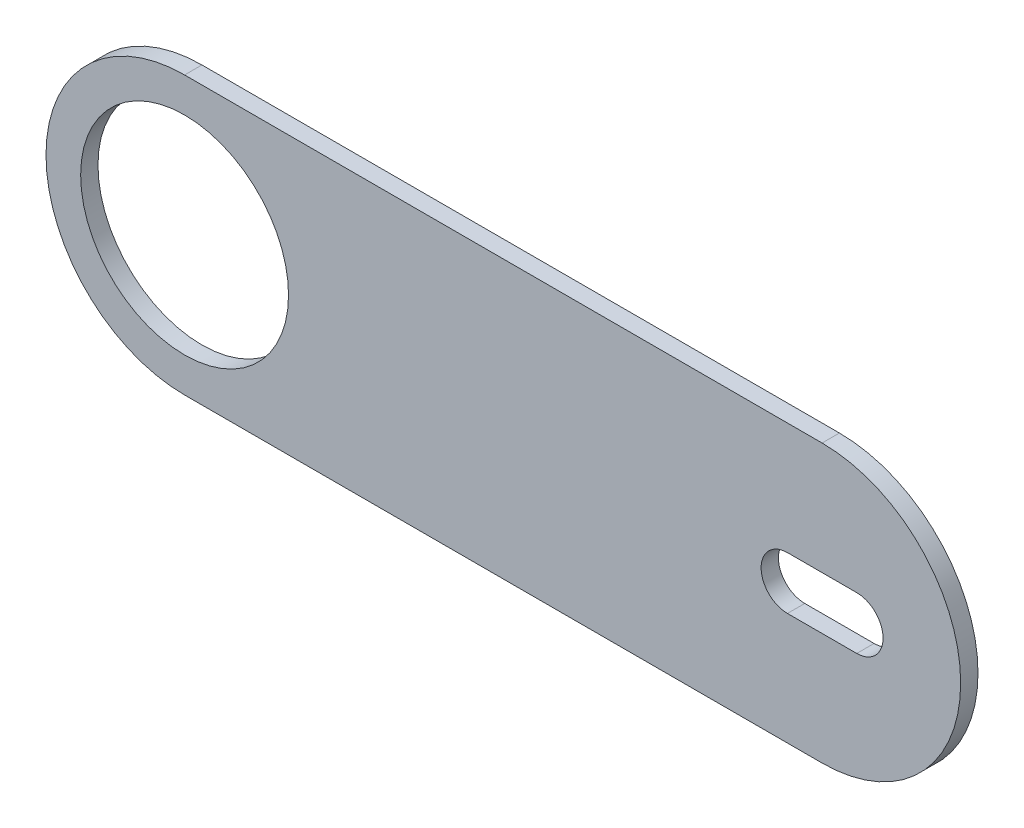
ISO-10303-21;
HEADER;
FILE_DESCRIPTION(('STEP AP214'),'2;1');
FILE_NAME('part.step','',(''),(''),'','','');
FILE_SCHEMA(('AUTOMOTIVE_DESIGN { 1 0 10303 214 1 1 1 1 }'));
ENDSEC;
DATA;
#1=APPLICATION_CONTEXT('core data for automotive mechanical design processes');
#2=APPLICATION_PROTOCOL_DEFINITION('international standard','automotive_design',2000,#1);
#3=PRODUCT_CONTEXT('',#1,'mechanical');
#4=PRODUCT('Part','Part','',(#3));
#5=PRODUCT_RELATED_PRODUCT_CATEGORY('part','',(#4));
#6=PRODUCT_DEFINITION_FORMATION('','',#4);
#7=PRODUCT_DEFINITION_CONTEXT('part definition',#1,'design');
#8=PRODUCT_DEFINITION('design','',#6,#7);
#9=PRODUCT_DEFINITION_SHAPE('','',#8);
#10=(LENGTH_UNIT() NAMED_UNIT(*) SI_UNIT(.MILLI.,.METRE.));
#11=(NAMED_UNIT(*) PLANE_ANGLE_UNIT() SI_UNIT($,.RADIAN.));
#12=(NAMED_UNIT(*) SI_UNIT($,.STERADIAN.) SOLID_ANGLE_UNIT());
#13=UNCERTAINTY_MEASURE_WITH_UNIT(LENGTH_MEASURE(1.E-05),#10,'distance_accuracy_value','');
#14=(GEOMETRIC_REPRESENTATION_CONTEXT(3) GLOBAL_UNCERTAINTY_ASSIGNED_CONTEXT((#13)) GLOBAL_UNIT_ASSIGNED_CONTEXT((#10,
#11,#12)) REPRESENTATION_CONTEXT('',''));
#15=CARTESIAN_POINT('',(0.,0.,0.));
#16=DIRECTION('',(0.,0.,1.));
#17=DIRECTION('',(1.,0.,0.));
#18=AXIS2_PLACEMENT_3D('',#15,#16,#17);
#19=CARTESIAN_POINT('',(-29.21,0.,1.5875));
#20=DIRECTION('',(0.,0.,1.));
#21=DIRECTION('',(1.,0.,0.));
#22=AXIS2_PLACEMENT_3D('',#19,#20,#21);
#23=PLANE('',#22);
#24=DIRECTION('',(-1.,0.,0.));
#25=VECTOR('',#24,1.);
#26=CARTESIAN_POINT('',(32.385,2.413,1.5875));
#27=LINE('',#26,#25);
#28=CARTESIAN_POINT('',(32.385,2.413,1.5875));
#29=VERTEX_POINT('',#28);
#30=CARTESIAN_POINT('',(26.035,2.413,1.5875));
#31=VERTEX_POINT('',#30);
#32=EDGE_CURVE('E115',#29,#31,#27,.T.);
#33=ORIENTED_EDGE('',*,*,#32,.F.);
#34=CARTESIAN_POINT('',(32.385,0.,1.5875));
#35=DIRECTION('',(0.,0.,1.));
#36=DIRECTION('',(1.,0.,0.));
#37=AXIS2_PLACEMENT_3D('',#34,#35,#36);
#38=CIRCLE('',#37,2.413);
#39=CARTESIAN_POINT('',(32.385,-2.413,1.5875));
#40=VERTEX_POINT('',#39);
#41=EDGE_CURVE('E107',#40,#29,#38,.T.);
#42=ORIENTED_EDGE('',*,*,#41,.F.);
#43=DIRECTION('',(1.,0.,0.));
#44=VECTOR('',#43,1.);
#45=CARTESIAN_POINT('',(32.385,-2.413,1.5875));
#46=LINE('',#45,#44);
#47=CARTESIAN_POINT('',(26.035,-2.413,1.5875));
#48=VERTEX_POINT('',#47);
#49=EDGE_CURVE('E130',#48,#40,#46,.T.);
#50=ORIENTED_EDGE('',*,*,#49,.F.);
#51=CARTESIAN_POINT('',(26.035,0.,1.5875));
#52=DIRECTION('',(0.,0.,1.));
#53=DIRECTION('',(1.,0.,0.));
#54=AXIS2_PLACEMENT_3D('',#51,#52,#53);
#55=CIRCLE('',#54,2.413);
#56=EDGE_CURVE('E128',#31,#48,#55,.T.);
#57=ORIENTED_EDGE('',*,*,#56,.F.);
#58=EDGE_LOOP('',(#33,#42,#50,#57));
#59=FACE_BOUND('',#58,.T.);
#60=CARTESIAN_POINT('',(-29.21,0.,1.5875));
#61=DIRECTION('',(0.,0.,1.));
#62=DIRECTION('',(1.,0.,0.));
#63=AXIS2_PLACEMENT_3D('',#60,#61,#62);
#64=CIRCLE('',#63,12.7);
#65=CARTESIAN_POINT('',(-29.21,12.7,1.5875));
#66=VERTEX_POINT('',#65);
#67=CARTESIAN_POINT('',(-29.21,-12.7,1.5875));
#68=VERTEX_POINT('',#67);
#69=EDGE_CURVE('E146',#66,#68,#64,.T.);
#70=ORIENTED_EDGE('',*,*,#69,.T.);
#71=DIRECTION('',(1.,0.,0.));
#72=VECTOR('',#71,1.);
#73=CARTESIAN_POINT('',(-29.21,-12.7,1.5875));
#74=LINE('',#73,#72);
#75=CARTESIAN_POINT('',(29.21,-12.7,1.5875));
#76=VERTEX_POINT('',#75);
#77=EDGE_CURVE('E149',#68,#76,#74,.T.);
#78=ORIENTED_EDGE('',*,*,#77,.T.);
#79=CARTESIAN_POINT('',(29.21,0.,1.5875));
#80=DIRECTION('',(0.,0.,1.));
#81=DIRECTION('',(1.,0.,0.));
#82=AXIS2_PLACEMENT_3D('',#79,#80,#81);
#83=CIRCLE('',#82,12.7);
#84=CARTESIAN_POINT('',(29.21,12.7,1.5875));
#85=VERTEX_POINT('',#84);
#86=EDGE_CURVE('E152',#76,#85,#83,.T.);
#87=ORIENTED_EDGE('',*,*,#86,.T.);
#88=DIRECTION('',(-1.,0.,0.));
#89=VECTOR('',#88,1.);
#90=CARTESIAN_POINT('',(-29.21,12.7,1.5875));
#91=LINE('',#90,#89);
#92=EDGE_CURVE('E154',#85,#66,#91,.T.);
#93=ORIENTED_EDGE('',*,*,#92,.T.);
#94=EDGE_LOOP('',(#70,#78,#87,#93));
#95=FACE_BOUND('',#94,.T.);
#96=CARTESIAN_POINT('',(-29.21,0.,1.5875));
#97=DIRECTION('',(0.,0.,1.));
#98=DIRECTION('',(1.,0.,0.));
#99=AXIS2_PLACEMENT_3D('',#96,#97,#98);
#100=CIRCLE('',#99,9.525);
#101=CARTESIAN_POINT('',(-19.685,0.,1.5875));
#102=VERTEX_POINT('',#101);
#103=EDGE_CURVE('E136',#102,#102,#100,.T.);
#104=ORIENTED_EDGE('',*,*,#103,.F.);
#105=EDGE_LOOP('',(#104));
#106=FACE_BOUND('',#105,.T.);
#107=ADVANCED_FACE('F42',(#59,#95,#106),#23,.T.);
#108=CARTESIAN_POINT('',(-29.21,0.,0.));
#109=DIRECTION('',(0.,0.,1.));
#110=DIRECTION('',(1.,0.,0.));
#111=AXIS2_PLACEMENT_3D('',#108,#109,#110);
#112=PLANE('',#111);
#113=CARTESIAN_POINT('',(-29.21,0.,0.));
#114=DIRECTION('',(0.,0.,1.));
#115=DIRECTION('',(1.,0.,0.));
#116=AXIS2_PLACEMENT_3D('',#113,#114,#115);
#117=CIRCLE('',#116,12.7);
#118=CARTESIAN_POINT('',(-29.21,12.7,0.));
#119=VERTEX_POINT('',#118);
#120=CARTESIAN_POINT('',(-29.21,-12.7,0.));
#121=VERTEX_POINT('',#120);
#122=EDGE_CURVE('E123',#119,#121,#117,.T.);
#123=ORIENTED_EDGE('',*,*,#122,.F.);
#124=DIRECTION('',(-1.,0.,0.));
#125=VECTOR('',#124,1.);
#126=CARTESIAN_POINT('',(-29.21,12.7,0.));
#127=LINE('',#126,#125);
#128=CARTESIAN_POINT('',(29.21,12.7,0.));
#129=VERTEX_POINT('',#128);
#130=EDGE_CURVE('E150',#129,#119,#127,.T.);
#131=ORIENTED_EDGE('',*,*,#130,.F.);
#132=CARTESIAN_POINT('',(29.21,0.,0.));
#133=DIRECTION('',(0.,0.,1.));
#134=DIRECTION('',(1.,0.,0.));
#135=AXIS2_PLACEMENT_3D('',#132,#133,#134);
#136=CIRCLE('',#135,12.7);
#137=CARTESIAN_POINT('',(29.21,-12.7,0.));
#138=VERTEX_POINT('',#137);
#139=EDGE_CURVE('E161',#138,#129,#136,.T.);
#140=ORIENTED_EDGE('',*,*,#139,.F.);
#141=DIRECTION('',(1.,0.,0.));
#142=VECTOR('',#141,1.);
#143=CARTESIAN_POINT('',(-29.21,-12.7,0.));
#144=LINE('',#143,#142);
#145=EDGE_CURVE('E159',#121,#138,#144,.T.);
#146=ORIENTED_EDGE('',*,*,#145,.F.);
#147=EDGE_LOOP('',(#123,#131,#140,#146));
#148=FACE_BOUND('',#147,.T.);
#149=CARTESIAN_POINT('',(32.385,0.,0.));
#150=DIRECTION('',(0.,0.,1.));
#151=DIRECTION('',(1.,0.,0.));
#152=AXIS2_PLACEMENT_3D('',#149,#150,#151);
#153=CIRCLE('',#152,2.413);
#154=CARTESIAN_POINT('',(32.385,-2.413,0.));
#155=VERTEX_POINT('',#154);
#156=CARTESIAN_POINT('',(32.385,2.413,0.));
#157=VERTEX_POINT('',#156);
#158=EDGE_CURVE('E65',#155,#157,#153,.T.);
#159=ORIENTED_EDGE('',*,*,#158,.T.);
#160=DIRECTION('',(-1.,0.,0.));
#161=VECTOR('',#160,1.);
#162=CARTESIAN_POINT('',(32.385,2.413,0.));
#163=LINE('',#162,#161);
#164=CARTESIAN_POINT('',(26.035,2.413,0.));
#165=VERTEX_POINT('',#164);
#166=EDGE_CURVE('E122',#157,#165,#163,.T.);
#167=ORIENTED_EDGE('',*,*,#166,.T.);
#168=CARTESIAN_POINT('',(26.035,0.,0.));
#169=DIRECTION('',(0.,0.,1.));
#170=DIRECTION('',(1.,0.,0.));
#171=AXIS2_PLACEMENT_3D('',#168,#169,#170);
#172=CIRCLE('',#171,2.413);
#173=CARTESIAN_POINT('',(26.035,-2.413,0.));
#174=VERTEX_POINT('',#173);
#175=EDGE_CURVE('E138',#165,#174,#172,.T.);
#176=ORIENTED_EDGE('',*,*,#175,.T.);
#177=DIRECTION('',(1.,0.,0.));
#178=VECTOR('',#177,1.);
#179=CARTESIAN_POINT('',(32.385,-2.413,0.));
#180=LINE('',#179,#178);
#181=EDGE_CURVE('E116',#174,#155,#180,.T.);
#182=ORIENTED_EDGE('',*,*,#181,.T.);
#183=EDGE_LOOP('',(#159,#167,#176,#182));
#184=FACE_BOUND('',#183,.T.);
#185=CARTESIAN_POINT('',(-29.21,0.,0.));
#186=DIRECTION('',(0.,0.,1.));
#187=DIRECTION('',(1.,0.,0.));
#188=AXIS2_PLACEMENT_3D('',#185,#186,#187);
#189=CIRCLE('',#188,9.525);
#190=CARTESIAN_POINT('',(-19.685,0.,0.));
#191=VERTEX_POINT('',#190);
#192=EDGE_CURVE('E232',#191,#191,#189,.T.);
#193=ORIENTED_EDGE('',*,*,#192,.T.);
#194=EDGE_LOOP('',(#193));
#195=FACE_BOUND('',#194,.T.);
#196=ADVANCED_FACE('F179',(#148,#184,#195),#112,.F.);
#197=CARTESIAN_POINT('',(-29.21,0.,1.5875));
#198=DIRECTION('',(0.,0.,-1.));
#199=DIRECTION('',(-1.,0.,0.));
#200=AXIS2_PLACEMENT_3D('',#197,#198,#199);
#201=CYLINDRICAL_SURFACE('',#200,12.7);
#202=ORIENTED_EDGE('',*,*,#122,.T.);
#203=DIRECTION('',(0.,0.,-1.));
#204=VECTOR('',#203,1.);
#205=CARTESIAN_POINT('',(-29.21,-12.7,1.5875));
#206=LINE('',#205,#204);
#207=EDGE_CURVE('E11',#68,#121,#206,.T.);
#208=ORIENTED_EDGE('',*,*,#207,.F.);
#209=ORIENTED_EDGE('',*,*,#69,.F.);
#210=DIRECTION('',(0.,0.,-1.));
#211=VECTOR('',#210,1.);
#212=CARTESIAN_POINT('',(-29.21,12.7,1.5875));
#213=LINE('',#212,#211);
#214=EDGE_CURVE('E156',#66,#119,#213,.T.);
#215=ORIENTED_EDGE('',*,*,#214,.T.);
#216=EDGE_LOOP('',(#202,#208,#209,#215));
#217=FACE_BOUND('',#216,.T.);
#218=ADVANCED_FACE('F44',(#217),#201,.T.);
#219=CARTESIAN_POINT('',(-29.21,-12.7,1.5875));
#220=DIRECTION('',(0.,1.,0.));
#221=DIRECTION('',(-1.,0.,0.));
#222=AXIS2_PLACEMENT_3D('',#219,#220,#221);
#223=PLANE('',#222);
#224=ORIENTED_EDGE('',*,*,#145,.T.);
#225=DIRECTION('',(0.,0.,-1.));
#226=VECTOR('',#225,1.);
#227=CARTESIAN_POINT('',(29.21,-12.7,1.5875));
#228=LINE('',#227,#226);
#229=EDGE_CURVE('E50',#76,#138,#228,.T.);
#230=ORIENTED_EDGE('',*,*,#229,.F.);
#231=ORIENTED_EDGE('',*,*,#77,.F.);
#232=ORIENTED_EDGE('',*,*,#207,.T.);
#233=EDGE_LOOP('',(#224,#230,#231,#232));
#234=FACE_BOUND('',#233,.T.);
#235=ADVANCED_FACE('F189',(#234),#223,.F.);
#236=CARTESIAN_POINT('',(29.21,0.,1.5875));
#237=DIRECTION('',(0.,0.,-1.));
#238=DIRECTION('',(-1.,0.,0.));
#239=AXIS2_PLACEMENT_3D('',#236,#237,#238);
#240=CYLINDRICAL_SURFACE('',#239,12.7);
#241=ORIENTED_EDGE('',*,*,#139,.T.);
#242=DIRECTION('',(0.,0.,-1.));
#243=VECTOR('',#242,1.);
#244=CARTESIAN_POINT('',(29.21,12.7,1.5875));
#245=LINE('',#244,#243);
#246=EDGE_CURVE('E166',#85,#129,#245,.T.);
#247=ORIENTED_EDGE('',*,*,#246,.F.);
#248=ORIENTED_EDGE('',*,*,#86,.F.);
#249=ORIENTED_EDGE('',*,*,#229,.T.);
#250=EDGE_LOOP('',(#241,#247,#248,#249));
#251=FACE_BOUND('',#250,.T.);
#252=ADVANCED_FACE('F173',(#251),#240,.T.);
#253=CARTESIAN_POINT('',(-29.21,12.7,1.5875));
#254=DIRECTION('',(0.,-1.,0.));
#255=DIRECTION('',(1.,0.,0.));
#256=AXIS2_PLACEMENT_3D('',#253,#254,#255);
#257=PLANE('',#256);
#258=ORIENTED_EDGE('',*,*,#130,.T.);
#259=ORIENTED_EDGE('',*,*,#214,.F.);
#260=ORIENTED_EDGE('',*,*,#92,.F.);
#261=ORIENTED_EDGE('',*,*,#246,.T.);
#262=EDGE_LOOP('',(#258,#259,#260,#261));
#263=FACE_BOUND('',#262,.T.);
#264=ADVANCED_FACE('F183',(#263),#257,.F.);
#265=CARTESIAN_POINT('',(32.385,0.,1.5875));
#266=DIRECTION('',(0.,0.,-1.));
#267=DIRECTION('',(-1.,0.,0.));
#268=AXIS2_PLACEMENT_3D('',#265,#266,#267);
#269=CYLINDRICAL_SURFACE('',#268,2.413);
#270=ORIENTED_EDGE('',*,*,#158,.F.);
#271=DIRECTION('',(0.,0.,-1.));
#272=VECTOR('',#271,1.);
#273=CARTESIAN_POINT('',(32.385,-2.413,1.5875));
#274=LINE('',#273,#272);
#275=EDGE_CURVE('E111',#40,#155,#274,.T.);
#276=ORIENTED_EDGE('',*,*,#275,.F.);
#277=ORIENTED_EDGE('',*,*,#41,.T.);
#278=DIRECTION('',(0.,0.,-1.));
#279=VECTOR('',#278,1.);
#280=CARTESIAN_POINT('',(32.385,2.413,1.5875));
#281=LINE('',#280,#279);
#282=EDGE_CURVE('E110',#29,#157,#281,.T.);
#283=ORIENTED_EDGE('',*,*,#282,.T.);
#284=EDGE_LOOP('',(#270,#276,#277,#283));
#285=FACE_BOUND('',#284,.T.);
#286=ADVANCED_FACE('F109',(#285),#269,.F.);
#287=CARTESIAN_POINT('',(32.385,2.413,1.5875));
#288=DIRECTION('',(0.,-1.,0.));
#289=DIRECTION('',(1.,0.,0.));
#290=AXIS2_PLACEMENT_3D('',#287,#288,#289);
#291=PLANE('',#290);
#292=ORIENTED_EDGE('',*,*,#166,.F.);
#293=ORIENTED_EDGE('',*,*,#282,.F.);
#294=ORIENTED_EDGE('',*,*,#32,.T.);
#295=DIRECTION('',(0.,0.,-1.));
#296=VECTOR('',#295,1.);
#297=CARTESIAN_POINT('',(26.035,2.413,1.5875));
#298=LINE('',#297,#296);
#299=EDGE_CURVE('E124',#31,#165,#298,.T.);
#300=ORIENTED_EDGE('',*,*,#299,.T.);
#301=EDGE_LOOP('',(#292,#293,#294,#300));
#302=FACE_BOUND('',#301,.T.);
#303=ADVANCED_FACE('F119',(#302),#291,.T.);
#304=CARTESIAN_POINT('',(26.035,0.,1.5875));
#305=DIRECTION('',(0.,0.,-1.));
#306=DIRECTION('',(-1.,0.,0.));
#307=AXIS2_PLACEMENT_3D('',#304,#305,#306);
#308=CYLINDRICAL_SURFACE('',#307,2.413);
#309=ORIENTED_EDGE('',*,*,#175,.F.);
#310=ORIENTED_EDGE('',*,*,#299,.F.);
#311=ORIENTED_EDGE('',*,*,#56,.T.);
#312=DIRECTION('',(0.,0.,-1.));
#313=VECTOR('',#312,1.);
#314=CARTESIAN_POINT('',(26.035,-2.413,1.5875));
#315=LINE('',#314,#313);
#316=EDGE_CURVE('E57',#48,#174,#315,.T.);
#317=ORIENTED_EDGE('',*,*,#316,.T.);
#318=EDGE_LOOP('',(#309,#310,#311,#317));
#319=FACE_BOUND('',#318,.T.);
#320=ADVANCED_FACE('F212',(#319),#308,.F.);
#321=CARTESIAN_POINT('',(32.385,-2.413,1.5875));
#322=DIRECTION('',(0.,1.,0.));
#323=DIRECTION('',(-1.,0.,0.));
#324=AXIS2_PLACEMENT_3D('',#321,#322,#323);
#325=PLANE('',#324);
#326=ORIENTED_EDGE('',*,*,#181,.F.);
#327=ORIENTED_EDGE('',*,*,#316,.F.);
#328=ORIENTED_EDGE('',*,*,#49,.T.);
#329=ORIENTED_EDGE('',*,*,#275,.T.);
#330=EDGE_LOOP('',(#326,#327,#328,#329));
#331=FACE_BOUND('',#330,.T.);
#332=ADVANCED_FACE('F216',(#331),#325,.T.);
#333=CARTESIAN_POINT('',(-29.21,0.,1.5875));
#334=DIRECTION('',(0.,0.,-1.));
#335=DIRECTION('',(-1.,0.,0.));
#336=AXIS2_PLACEMENT_3D('',#333,#334,#335);
#337=CYLINDRICAL_SURFACE('',#336,9.525);
#338=ORIENTED_EDGE('',*,*,#103,.T.);
#339=EDGE_LOOP('',(#338));
#340=FACE_BOUND('',#339,.T.);
#341=ORIENTED_EDGE('',*,*,#192,.F.);
#342=EDGE_LOOP('',(#341));
#343=FACE_BOUND('',#342,.T.);
#344=ADVANCED_FACE('F222',(#340,#343),#337,.F.);
#345=CLOSED_SHELL('',(#107,#196,#218,#235,#252,#264,#286,#303,#320,#332,#344));
#346=MANIFOLD_SOLID_BREP('B2',#345);
#347=ADVANCED_BREP_SHAPE_REPRESENTATION('',(#18,#346),#14);
#348=SHAPE_DEFINITION_REPRESENTATION(#9,#347);
ENDSEC;
END-ISO-10303-21;
